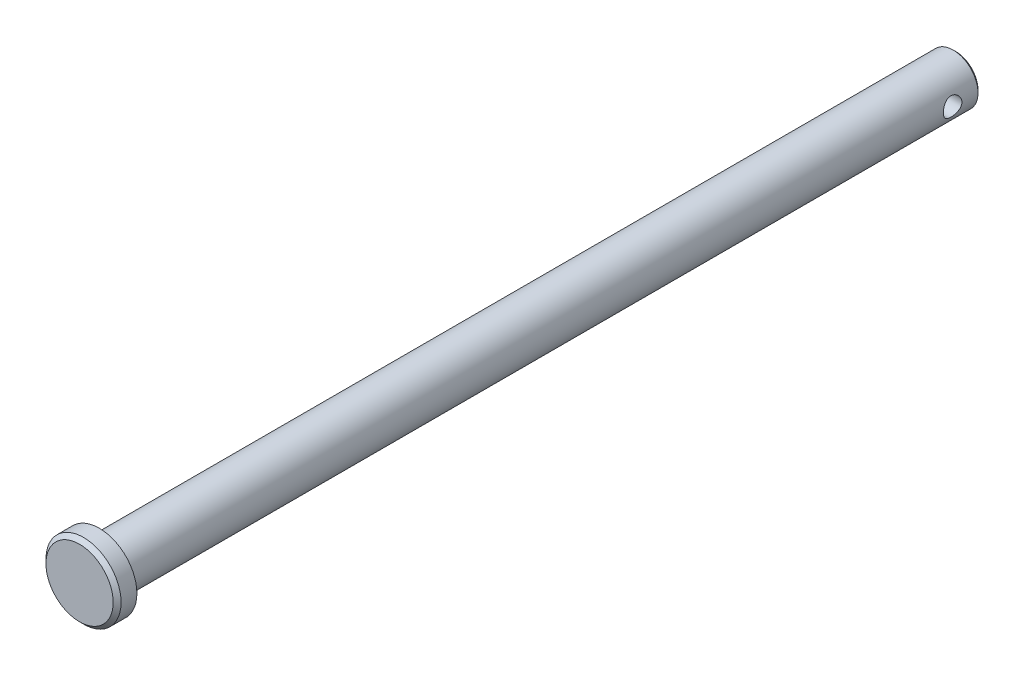
ISO-10303-21;
HEADER;
FILE_DESCRIPTION(('STEP AP214'),'2;1');
FILE_NAME('part.step','',(''),(''),'','','');
FILE_SCHEMA(('AUTOMOTIVE_DESIGN { 1 0 10303 214 1 1 1 1 }'));
ENDSEC;
DATA;
#1=APPLICATION_CONTEXT('core data for automotive mechanical design processes');
#2=APPLICATION_PROTOCOL_DEFINITION('international standard','automotive_design',2000,#1);
#3=PRODUCT_CONTEXT('',#1,'mechanical');
#4=PRODUCT('Part','Part','',(#3));
#5=PRODUCT_RELATED_PRODUCT_CATEGORY('part','',(#4));
#6=PRODUCT_DEFINITION_FORMATION('','',#4);
#7=PRODUCT_DEFINITION_CONTEXT('part definition',#1,'design');
#8=PRODUCT_DEFINITION('design','',#6,#7);
#9=PRODUCT_DEFINITION_SHAPE('','',#8);
#10=(LENGTH_UNIT() NAMED_UNIT(*) SI_UNIT(.MILLI.,.METRE.));
#11=(NAMED_UNIT(*) PLANE_ANGLE_UNIT() SI_UNIT($,.RADIAN.));
#12=(NAMED_UNIT(*) SI_UNIT($,.STERADIAN.) SOLID_ANGLE_UNIT());
#13=UNCERTAINTY_MEASURE_WITH_UNIT(LENGTH_MEASURE(1.E-05),#10,'distance_accuracy_value','');
#14=(GEOMETRIC_REPRESENTATION_CONTEXT(3) GLOBAL_UNCERTAINTY_ASSIGNED_CONTEXT((#13)) GLOBAL_UNIT_ASSIGNED_CONTEXT((#10,
#11,#12)) REPRESENTATION_CONTEXT('',''));
#15=CARTESIAN_POINT('',(0.,0.,0.));
#16=DIRECTION('',(0.,0.,1.));
#17=DIRECTION('',(1.,0.,0.));
#18=AXIS2_PLACEMENT_3D('',#15,#16,#17);
#19=CARTESIAN_POINT('',(0.,0.,55.));
#20=DIRECTION('',(0.,0.,-1.));
#21=DIRECTION('',(-1.,0.,0.));
#22=AXIS2_PLACEMENT_3D('',#19,#20,#21);
#23=CYLINDRICAL_SURFACE('',#22,3.175);
#24=CARTESIAN_POINT('',(0.,0.,-54.6825));
#25=DIRECTION('',(0.,0.,1.));
#26=DIRECTION('',(1.,0.,0.));
#27=AXIS2_PLACEMENT_3D('',#24,#25,#26);
#28=CIRCLE('',#27,3.175);
#29=CARTESIAN_POINT('',(3.175,0.,-54.6825));
#30=VERTEX_POINT('',#29);
#31=EDGE_CURVE('E38',#30,#30,#28,.T.);
#32=ORIENTED_EDGE('',*,*,#31,.T.);
#33=EDGE_LOOP('',(#32));
#34=FACE_BOUND('',#33,.T.);
#35=CARTESIAN_POINT('',(-3.175,0.,-50.234325));
#36=CARTESIAN_POINT('',(-3.1750017260582,-0.064480328031921,-50.2343226962969));
#37=CARTESIAN_POINT('',(-3.17301863556027,-0.128944879414298,-50.2395794346971));
#38=CARTESIAN_POINT('',(-3.16530589955499,-0.255947427804688,-50.2603823799955));
#39=CARTESIAN_POINT('',(-3.15957679372107,-0.318485700965171,-50.2759271047485));
#40=CARTESIAN_POINT('',(-3.14498698210789,-0.439785748086511,-50.3166789451563));
#41=CARTESIAN_POINT('',(-3.13613231952368,-0.498554552928809,-50.3418674227273));
#42=CARTESIAN_POINT('',(-3.11617334413749,-0.611028202439702,-50.4010969653313));
#43=CARTESIAN_POINT('',(-3.10506842811866,-0.664731683597442,-50.4351404047757));
#44=CARTESIAN_POINT('',(-3.08122833533403,-0.767831218530127,-50.5126236965375));
#45=CARTESIAN_POINT('',(-3.06844702050705,-0.816983642057514,-50.5563733956684));
#46=CARTESIAN_POINT('',(-3.04292175316615,-0.907450095452763,-50.6513695325105));
#47=CARTESIAN_POINT('',(-3.03017781325932,-0.948761726101175,-50.7026182563948));
#48=CARTESIAN_POINT('',(-3.00563336052824,-1.02392323008938,-50.8135382398466));
#49=CARTESIAN_POINT('',(-2.99388727501525,-1.05742893349135,-50.8734559659457));
#50=CARTESIAN_POINT('',(-2.97338639063463,-1.1137792552768,-50.9985858811213));
#51=CARTESIAN_POINT('',(-2.96463039737105,-1.13662813187984,-51.0637959432544));
#52=CARTESIAN_POINT('',(-2.95159440179158,-1.1700544212018,-51.1948551625799));
#53=CARTESIAN_POINT('',(-2.94714552453477,-1.18109677117231,-51.2605683742581));
#54=CARTESIAN_POINT('',(-2.94273336284839,-1.19205022996996,-51.3930540754076));
#55=CARTESIAN_POINT('',(-2.94276822592073,-1.19196593587088,-51.4598261160129));
#56=CARTESIAN_POINT('',(-2.94717399857943,-1.18102403502952,-51.5882795606378));
#57=CARTESIAN_POINT('',(-2.95128528416453,-1.17081148004022,-51.6500264691726));
#58=CARTESIAN_POINT('',(-2.96294919584751,-1.14096933245487,-51.7708560506342));
#59=CARTESIAN_POINT('',(-2.97050234018473,-1.12133832170211,-51.8299383208748));
#60=CARTESIAN_POINT('',(-2.98835526113513,-1.07286225428949,-51.9450761725093));
#61=CARTESIAN_POINT('',(-2.99870429903107,-1.04384989935074,-52.0010533421088));
#62=CARTESIAN_POINT('',(-3.02096654298085,-0.977551335491413,-52.1075319292128));
#63=CARTESIAN_POINT('',(-3.03288028850369,-0.940262269910617,-52.1580314471563));
#64=CARTESIAN_POINT('',(-3.05790630844421,-0.855517884834482,-52.2556916580229));
#65=CARTESIAN_POINT('',(-3.07104532042939,-0.807547746065835,-52.3023998585938));
#66=CARTESIAN_POINT('',(-3.09635309230243,-0.704304368962597,-52.3872432606759));
#67=CARTESIAN_POINT('',(-3.10852170288599,-0.649030010276031,-52.4253771445933));
#68=CARTESIAN_POINT('',(-3.13075950879707,-0.531592978112732,-52.4924885026684));
#69=CARTESIAN_POINT('',(-3.1407933299357,-0.469337004114245,-52.5213152675942));
#70=CARTESIAN_POINT('',(-3.15736857672026,-0.340389250103888,-52.5679361921393));
#71=CARTESIAN_POINT('',(-3.1639115533356,-0.273699454858827,-52.5857352518954));
#72=CARTESIAN_POINT('',(-3.17249526812277,-0.141585349249252,-52.6089255876114));
#73=CARTESIAN_POINT('',(-3.17475686664138,-0.0762822480275031,-52.6149261938161));
#74=CARTESIAN_POINT('',(-3.17520553124475,0.054429402233676,-52.6161235319706));
#75=CARTESIAN_POINT('',(-3.17339350069573,0.119837924680553,-52.6113226592514));
#76=CARTESIAN_POINT('',(-3.16604419632035,0.246270501045977,-52.5915164039175));
#77=CARTESIAN_POINT('',(-3.16065273826329,0.307366454105824,-52.5769102121587));
#78=CARTESIAN_POINT('',(-3.1468335994155,0.426197517997295,-52.5384335549156));
#79=CARTESIAN_POINT('',(-3.13840552373861,0.483932190588357,-52.5145618845037));
#80=CARTESIAN_POINT('',(-3.11903764373597,0.596302913556188,-52.4574707851262));
#81=CARTESIAN_POINT('',(-3.1080313141617,0.650798072574003,-52.4239973024289));
#82=CARTESIAN_POINT('',(-3.08472420554452,0.753580464933011,-52.3489400056076));
#83=CARTESIAN_POINT('',(-3.07242294938803,0.801865395464672,-52.3073531972923));
#84=CARTESIAN_POINT('',(-3.04699455283473,0.893786946503482,-52.2144104780639));
#85=CARTESIAN_POINT('',(-3.03386090349835,0.936991348355828,-52.1626277674242));
#86=CARTESIAN_POINT('',(-3.00893809999065,1.01418270962824,-52.0522892133883));
#87=CARTESIAN_POINT('',(-2.99714906660554,1.04816884135274,-51.9937327624604));
#88=CARTESIAN_POINT('',(-2.9762992117158,1.10599357730704,-51.8710248104995));
#89=CARTESIAN_POINT('',(-2.96724991010742,1.12978950323491,-51.8068511079336));
#90=CARTESIAN_POINT('',(-2.95317888607235,1.16608132501843,-51.6749735000728));
#91=CARTESIAN_POINT('',(-2.94815467214383,1.17858421180019,-51.6072718062677));
#92=CARTESIAN_POINT('',(-2.94303366491605,1.1913103800891,-51.4749434233642));
#93=CARTESIAN_POINT('',(-2.94264115340402,1.19227069374821,-51.4103984735747));
#94=CARTESIAN_POINT('',(-2.94606990116575,1.18377268040514,-51.2821184052058));
#95=CARTESIAN_POINT('',(-2.94989076088501,1.17431534131036,-51.2183832104169));
#96=CARTESIAN_POINT('',(-2.96106962383437,1.14582428656504,-51.0955062637937));
#97=CARTESIAN_POINT('',(-2.96831611517726,1.12709164913741,-51.0362836876677));
#98=CARTESIAN_POINT('',(-2.98546478961414,1.08084696819061,-50.9217875026325));
#99=CARTESIAN_POINT('',(-2.99536764396202,1.0533327052505,-50.8665148963443));
#100=CARTESIAN_POINT('',(-3.01735905848772,0.988632102759095,-50.7583374856775));
#101=CARTESIAN_POINT('',(-3.02953498137515,0.951014360373894,-50.7057086800401));
#102=CARTESIAN_POINT('',(-3.05439958363509,0.867842480481129,-50.6072751359791));
#103=CARTESIAN_POINT('',(-3.06708842498621,0.822285820601664,-50.561472575013));
#104=CARTESIAN_POINT('',(-3.09237399534093,0.721582564947793,-50.4754646975664));
#105=CARTESIAN_POINT('',(-3.10492858264887,0.666050423844062,-50.4356963957112));
#106=CARTESIAN_POINT('',(-3.12780770850268,0.548650495915651,-50.3660695173742));
#107=CARTESIAN_POINT('',(-3.13813207344675,0.486782216434429,-50.3362117122343));
#108=CARTESIAN_POINT('',(-3.15574594756552,0.355599271339333,-50.2864133919429));
#109=CARTESIAN_POINT('',(-3.16288465369445,0.286078153898402,-50.2669583924722));
#110=CARTESIAN_POINT('',(-3.17250954730047,0.144363863550065,-50.240918713063));
#111=CARTESIAN_POINT('',(-3.17499806804399,0.0721720492396064,-50.2343275785069));
#112=CARTESIAN_POINT('',(-3.175,0.,-50.234325));
#113=B_SPLINE_CURVE_WITH_KNOTS('',3,(#35,#36,#37,#38,#39,#40,#41,#42,#43,#44,#45,#46,#47,#48,
#49,#50,#51,#52,#53,#54,#55,#56,#57,#58,#59,#60,#61,#62,#63,#64,#65,#66,#67,#68,#69,#70,#71,#72,
#73,#74,#75,#76,#77,#78,#79,#80,#81,#82,#83,#84,#85,#86,#87,#88,#89,#90,#91,#92,#93,#94,#95,#96,
#97,#98,#99,#100,#101,#102,#103,#104,#105,#106,#107,#108,#109,#110,#111,#112),.UNSPECIFIED.,.T.,
.F.,(4,2,2,2,2,2,2,2,2,2,2,2,2,2,2,2,2,2,2,2,2,2,2,2,2,2,2,2,2,2,2,2,2,2,2,2,2,2,4),(0.,
0.193174779988696,0.386321736189804,0.579097274313275,0.771924557565038,0.972134347500311,
1.17240530159713,1.38030485385692,1.58812126298256,1.78741287818417,1.98662215450768,
2.17390936438978,2.36122478335594,2.55208411657196,2.74300942653256,2.94676634210303,
3.15055454712147,3.35749404133323,3.5643415163596,3.76019234336017,3.95599974284977,
4.14428335102049,4.33259145270723,4.52643257351058,4.72034536640771,4.92550862317929,
5.13069029517863,5.33672309214718,5.54262825746729,5.73531018512452,5.92797384230189,
6.11475744301062,6.30158828783604,6.49821274558142,6.6948997896017,6.90223036662895,
7.10957707657801,7.32590383806685,7.54212202675678),.UNSPECIFIED.);
#114=CARTESIAN_POINT('',(-3.175,0.,-50.234325));
#115=VERTEX_POINT('',#114);
#116=EDGE_CURVE('E49',#115,#115,#113,.T.);
#117=ORIENTED_EDGE('',*,*,#116,.T.);
#118=EDGE_LOOP('',(#117));
#119=FACE_BOUND('',#118,.T.);
#120=CARTESIAN_POINT('',(3.175,0.,-52.615575));
#121=CARTESIAN_POINT('',(3.1750017260582,-0.0644803280319211,-52.6155773037031));
#122=CARTESIAN_POINT('',(3.17301863556027,-0.128944879414298,-52.6103205653028));
#123=CARTESIAN_POINT('',(3.16530589955499,-0.255947427804688,-52.5895176200045));
#124=CARTESIAN_POINT('',(3.15957679372107,-0.318485700965171,-52.5739728952515));
#125=CARTESIAN_POINT('',(3.14498698210789,-0.439785748086511,-52.5332210548437));
#126=CARTESIAN_POINT('',(3.13613231952368,-0.498554552928809,-52.5080325772727));
#127=CARTESIAN_POINT('',(3.11617334413749,-0.611028202439702,-52.4488030346687));
#128=CARTESIAN_POINT('',(3.10506842811866,-0.664731683597442,-52.4147595952243));
#129=CARTESIAN_POINT('',(3.08122833533403,-0.767831218530127,-52.3372763034625));
#130=CARTESIAN_POINT('',(3.06844702050705,-0.816983642057514,-52.2935266043316));
#131=CARTESIAN_POINT('',(3.04292175316615,-0.907450095452763,-52.1985304674895));
#132=CARTESIAN_POINT('',(3.03017781325932,-0.948761726101175,-52.1472817436052));
#133=CARTESIAN_POINT('',(3.00563336052824,-1.02392323008938,-52.0363617601534));
#134=CARTESIAN_POINT('',(2.99388727501525,-1.05742893349135,-51.9764440340542));
#135=CARTESIAN_POINT('',(2.97338639063463,-1.1137792552768,-51.8513141188787));
#136=CARTESIAN_POINT('',(2.96463039737105,-1.13662813187984,-51.7861040567456));
#137=CARTESIAN_POINT('',(2.95159440179158,-1.1700544212018,-51.6550448374201));
#138=CARTESIAN_POINT('',(2.94714552453477,-1.18109677117231,-51.5893316257419));
#139=CARTESIAN_POINT('',(2.94273336284839,-1.19205022996996,-51.4568459245924));
#140=CARTESIAN_POINT('',(2.94276822592073,-1.19196593587088,-51.3900738839871));
#141=CARTESIAN_POINT('',(2.94717399857943,-1.18102403502952,-51.2616204393622));
#142=CARTESIAN_POINT('',(2.95128528416453,-1.17081148004022,-51.1998735308274));
#143=CARTESIAN_POINT('',(2.96294919584751,-1.14096933245487,-51.0790439493658));
#144=CARTESIAN_POINT('',(2.97050234018473,-1.12133832170211,-51.0199616791252));
#145=CARTESIAN_POINT('',(2.98835526113513,-1.07286225428949,-50.9048238274907));
#146=CARTESIAN_POINT('',(2.99870429903107,-1.04384989935074,-50.8488466578912));
#147=CARTESIAN_POINT('',(3.02096654298085,-0.977551335491415,-50.7423680707872));
#148=CARTESIAN_POINT('',(3.03288028850369,-0.940262269910621,-50.6918685528437));
#149=CARTESIAN_POINT('',(3.05790630844421,-0.855517884834488,-50.5942083419771));
#150=CARTESIAN_POINT('',(3.07104532042938,-0.80754774606584,-50.5475001414062));
#151=CARTESIAN_POINT('',(3.09635309230243,-0.704304368962601,-50.4626567393241));
#152=CARTESIAN_POINT('',(3.10852170288599,-0.649030010276034,-50.4245228554067));
#153=CARTESIAN_POINT('',(3.13075950879707,-0.531592978112732,-50.3574114973316));
#154=CARTESIAN_POINT('',(3.1407933299357,-0.469337004114245,-50.3285847324058));
#155=CARTESIAN_POINT('',(3.15736857672026,-0.340389250103886,-50.2819638078606));
#156=CARTESIAN_POINT('',(3.1639115533356,-0.273699454858827,-50.2641647481046));
#157=CARTESIAN_POINT('',(3.17249526812277,-0.141585349249252,-50.2409744123886));
#158=CARTESIAN_POINT('',(3.17475686664138,-0.0762822480275028,-50.2349738061839));
#159=CARTESIAN_POINT('',(3.17520553124475,0.0544294022336763,-50.2337764680294));
#160=CARTESIAN_POINT('',(3.17339350069573,0.119837924680553,-50.2385773407486));
#161=CARTESIAN_POINT('',(3.16604419632035,0.246270501045978,-50.2583835960825));
#162=CARTESIAN_POINT('',(3.16065273826329,0.307366454105826,-50.2729897878413));
#163=CARTESIAN_POINT('',(3.1468335994155,0.426197517997297,-50.3114664450844));
#164=CARTESIAN_POINT('',(3.13840552373861,0.483932190588357,-50.3353381154962));
#165=CARTESIAN_POINT('',(3.11903764373597,0.596302913556187,-50.3924292148738));
#166=CARTESIAN_POINT('',(3.1080313141617,0.650798072574003,-50.4259026975711));
#167=CARTESIAN_POINT('',(3.08472420554452,0.753580464933012,-50.5009599943924));
#168=CARTESIAN_POINT('',(3.07242294938803,0.801865395464673,-50.5425468027077));
#169=CARTESIAN_POINT('',(3.04699455283473,0.893786946503483,-50.6354895219361));
#170=CARTESIAN_POINT('',(3.03386090349835,0.936991348355827,-50.6872722325758));
#171=CARTESIAN_POINT('',(3.00893809999065,1.01418270962823,-50.7976107866117));
#172=CARTESIAN_POINT('',(2.99714906660554,1.04816884135274,-50.8561672375396));
#173=CARTESIAN_POINT('',(2.9762992117158,1.10599357730705,-50.9788751895005));
#174=CARTESIAN_POINT('',(2.96724991010741,1.12978950323492,-51.0430488920664));
#175=CARTESIAN_POINT('',(2.95317888607235,1.16608132501844,-51.1749264999272));
#176=CARTESIAN_POINT('',(2.94815467214383,1.17858421180019,-51.2426281937323));
#177=CARTESIAN_POINT('',(2.94303366491605,1.1913103800891,-51.3749565766358));
#178=CARTESIAN_POINT('',(2.94264115340402,1.19227069374821,-51.4395015264253));
#179=CARTESIAN_POINT('',(2.94606990116575,1.18377268040514,-51.5677815947942));
#180=CARTESIAN_POINT('',(2.94989076088501,1.17431534131036,-51.6315167895831));
#181=CARTESIAN_POINT('',(2.96106962383437,1.14582428656504,-51.7543937362063));
#182=CARTESIAN_POINT('',(2.96831611517726,1.12709164913741,-51.8136163123322));
#183=CARTESIAN_POINT('',(2.98546478961414,1.08084696819061,-51.9281124973675));
#184=CARTESIAN_POINT('',(2.99536764396202,1.0533327052505,-51.9833851036557));
#185=CARTESIAN_POINT('',(3.01735905848772,0.988632102759095,-52.0915625143225));
#186=CARTESIAN_POINT('',(3.02953498137515,0.951014360373894,-52.1441913199599));
#187=CARTESIAN_POINT('',(3.05439958363509,0.867842480481129,-52.2426248640209));
#188=CARTESIAN_POINT('',(3.06708842498621,0.822285820601664,-52.288427424987));
#189=CARTESIAN_POINT('',(3.09237399534093,0.721582564947793,-52.3744353024336));
#190=CARTESIAN_POINT('',(3.10492858264887,0.666050423844062,-52.4142036042888));
#191=CARTESIAN_POINT('',(3.12780770850268,0.548650495915651,-52.4838304826258));
#192=CARTESIAN_POINT('',(3.13813207344675,0.486782216434429,-52.5136882877657));
#193=CARTESIAN_POINT('',(3.15574594756552,0.355599271339333,-52.5634866080571));
#194=CARTESIAN_POINT('',(3.16288465369445,0.286078153898402,-52.5829416075278));
#195=CARTESIAN_POINT('',(3.17250954730047,0.144363863550066,-52.608981286937));
#196=CARTESIAN_POINT('',(3.17499806804399,0.0721720492396069,-52.6155724214931));
#197=CARTESIAN_POINT('',(3.175,0.,-52.615575));
#198=B_SPLINE_CURVE_WITH_KNOTS('',3,(#120,#121,#122,#123,#124,#125,#126,#127,#128,#129,#130,
#131,#132,#133,#134,#135,#136,#137,#138,#139,#140,#141,#142,#143,#144,#145,#146,#147,#148,#149,
#150,#151,#152,#153,#154,#155,#156,#157,#158,#159,#160,#161,#162,#163,#164,#165,#166,#167,#168,
#169,#170,#171,#172,#173,#174,#175,#176,#177,#178,#179,#180,#181,#182,#183,#184,#185,#186,#187,
#188,#189,#190,#191,#192,#193,#194,#195,#196,#197),.UNSPECIFIED.,.T.,.F.,(4,2,2,2,2,2,2,2,2,2,2,
2,2,2,2,2,2,2,2,2,2,2,2,2,2,2,2,2,2,2,2,2,2,2,2,2,2,2,4),(0.,0.193174779988695,
0.386321736189804,0.579097274313274,0.771924557565037,0.972134347500311,1.17240530159713,
1.38030485385692,1.58812126298256,1.78741287818416,1.98662215450768,2.17390936438978,
2.36122478335594,2.55208411657196,2.74300942653255,2.94676634210302,3.15055454712147,
3.35749404133323,3.5643415163596,3.76019234336017,3.95599974284977,4.14428335102049,
4.33259145270723,4.52643257351058,4.72034536640771,4.92550862317929,5.13069029517863,
5.33672309214719,5.54262825746729,5.73531018512451,5.92797384230188,6.11475744301063,
6.30158828783604,6.49821274558142,6.69489978960169,6.90223036662895,7.10957707657801,
7.32590383806685,7.54212202675677),.UNSPECIFIED.);
#199=CARTESIAN_POINT('',(3.175,0.,-52.615575));
#200=VERTEX_POINT('',#199);
#201=EDGE_CURVE('E57',#200,#200,#198,.T.);
#202=ORIENTED_EDGE('',*,*,#201,.T.);
#203=EDGE_LOOP('',(#202));
#204=FACE_BOUND('',#203,.T.);
#205=CARTESIAN_POINT('',(0.,0.,55.));
#206=DIRECTION('',(0.,0.,1.));
#207=DIRECTION('',(1.,0.,0.));
#208=AXIS2_PLACEMENT_3D('',#205,#206,#207);
#209=CIRCLE('',#208,3.175);
#210=CARTESIAN_POINT('',(3.175,0.,55.));
#211=VERTEX_POINT('',#210);
#212=EDGE_CURVE('E95',#211,#211,#209,.T.);
#213=ORIENTED_EDGE('',*,*,#212,.F.);
#214=EDGE_LOOP('',(#213));
#215=FACE_BOUND('',#214,.T.);
#216=ADVANCED_FACE('F31',(#34,#119,#204,#215),#23,.T.);
#217=CARTESIAN_POINT('',(0.,0.,-55.));
#218=DIRECTION('',(0.,0.,1.));
#219=DIRECTION('',(1.,0.,0.));
#220=AXIS2_PLACEMENT_3D('',#217,#218,#219);
#221=PLANE('',#220);
#222=CARTESIAN_POINT('',(0.,0.,-55.));
#223=DIRECTION('',(0.,0.,1.));
#224=DIRECTION('',(1.,0.,0.));
#225=AXIS2_PLACEMENT_3D('',#222,#223,#224);
#226=CIRCLE('',#225,2.85749999999998);
#227=CARTESIAN_POINT('',(2.85749999999998,0.,-55.));
#228=VERTEX_POINT('',#227);
#229=EDGE_CURVE('E10',#228,#228,#226,.F.);
#230=ORIENTED_EDGE('',*,*,#229,.T.);
#231=EDGE_LOOP('',(#230));
#232=FACE_BOUND('',#231,.T.);
#233=ADVANCED_FACE('F79',(#232),#221,.F.);
#234=CARTESIAN_POINT('',(0.,0.,57.54));
#235=DIRECTION('',(0.,0.,-1.));
#236=DIRECTION('',(-1.,0.,0.));
#237=AXIS2_PLACEMENT_3D('',#234,#235,#236);
#238=CYLINDRICAL_SURFACE('',#237,4.826);
#239=CARTESIAN_POINT('',(0.,0.,57.032));
#240=DIRECTION('',(0.,0.,1.));
#241=DIRECTION('',(1.,0.,0.));
#242=AXIS2_PLACEMENT_3D('',#239,#240,#241);
#243=CIRCLE('',#242,4.826);
#244=CARTESIAN_POINT('',(4.826,0.,57.032));
#245=VERTEX_POINT('',#244);
#246=EDGE_CURVE('E42',#245,#245,#243,.F.);
#247=ORIENTED_EDGE('',*,*,#246,.T.);
#248=EDGE_LOOP('',(#247));
#249=FACE_BOUND('',#248,.T.);
#250=CARTESIAN_POINT('',(0.,0.,55.));
#251=DIRECTION('',(0.,0.,1.));
#252=DIRECTION('',(1.,0.,0.));
#253=AXIS2_PLACEMENT_3D('',#250,#251,#252);
#254=CIRCLE('',#253,4.826);
#255=CARTESIAN_POINT('',(4.826,0.,55.));
#256=VERTEX_POINT('',#255);
#257=EDGE_CURVE('E56',#256,#256,#254,.T.);
#258=ORIENTED_EDGE('',*,*,#257,.T.);
#259=EDGE_LOOP('',(#258));
#260=FACE_BOUND('',#259,.T.);
#261=ADVANCED_FACE('F73',(#249,#260),#238,.T.);
#262=CARTESIAN_POINT('',(0.,0.,57.54));
#263=DIRECTION('',(0.,0.,1.));
#264=DIRECTION('',(1.,0.,0.));
#265=AXIS2_PLACEMENT_3D('',#262,#263,#264);
#266=PLANE('',#265);
#267=CARTESIAN_POINT('',(0.,0.,57.54));
#268=DIRECTION('',(0.,0.,1.));
#269=DIRECTION('',(1.,0.,0.));
#270=AXIS2_PLACEMENT_3D('',#267,#268,#269);
#271=CIRCLE('',#270,4.318);
#272=CARTESIAN_POINT('',(4.318,0.,57.54));
#273=VERTEX_POINT('',#272);
#274=EDGE_CURVE('E46',#273,#273,#271,.T.);
#275=ORIENTED_EDGE('',*,*,#274,.T.);
#276=EDGE_LOOP('',(#275));
#277=FACE_BOUND('',#276,.T.);
#278=ADVANCED_FACE('F68',(#277),#266,.T.);
#279=CARTESIAN_POINT('',(0.,0.,55.));
#280=DIRECTION('',(0.,0.,1.));
#281=DIRECTION('',(1.,0.,0.));
#282=AXIS2_PLACEMENT_3D('',#279,#280,#281);
#283=PLANE('',#282);
#284=ORIENTED_EDGE('',*,*,#212,.T.);
#285=EDGE_LOOP('',(#284));
#286=FACE_BOUND('',#285,.T.);
#287=ORIENTED_EDGE('',*,*,#257,.F.);
#288=EDGE_LOOP('',(#287));
#289=FACE_BOUND('',#288,.T.);
#290=ADVANCED_FACE('F72',(#286,#289),#283,.F.);
#291=CARTESIAN_POINT('',(0.,0.,57.54));
#292=DIRECTION('',(0.,0.,-1.));
#293=DIRECTION('',(-1.,0.,0.));
#294=AXIS2_PLACEMENT_3D('',#291,#292,#293);
#295=CONICAL_SURFACE('',#294,4.318,0.785398163397444);
#296=ORIENTED_EDGE('',*,*,#246,.F.);
#297=EDGE_LOOP('',(#296));
#298=FACE_BOUND('',#297,.T.);
#299=ORIENTED_EDGE('',*,*,#274,.F.);
#300=EDGE_LOOP('',(#299));
#301=FACE_BOUND('',#300,.T.);
#302=ADVANCED_FACE('F66',(#298,#301),#295,.T.);
#303=CARTESIAN_POINT('',(-4.826,0.,-51.42495));
#304=DIRECTION('',(1.,0.,0.));
#305=DIRECTION('',(0.,0.,-1.));
#306=AXIS2_PLACEMENT_3D('',#303,#304,#305);
#307=CYLINDRICAL_SURFACE('',#306,1.190625);
#308=ORIENTED_EDGE('',*,*,#201,.F.);
#309=EDGE_LOOP('',(#308));
#310=FACE_BOUND('',#309,.T.);
#311=ORIENTED_EDGE('',*,*,#116,.F.);
#312=EDGE_LOOP('',(#311));
#313=FACE_BOUND('',#312,.T.);
#314=ADVANCED_FACE('F62',(#310,#313),#307,.F.);
#315=CARTESIAN_POINT('',(0.,0.,-54.6825));
#316=DIRECTION('',(0.,0.,1.));
#317=DIRECTION('',(1.,0.,0.));
#318=AXIS2_PLACEMENT_3D('',#315,#316,#317);
#319=CONICAL_SURFACE('',#318,3.175,0.785398163397452);
#320=ORIENTED_EDGE('',*,*,#229,.F.);
#321=EDGE_LOOP('',(#320));
#322=FACE_BOUND('',#321,.T.);
#323=ORIENTED_EDGE('',*,*,#31,.F.);
#324=EDGE_LOOP('',(#323));
#325=FACE_BOUND('',#324,.T.);
#326=ADVANCED_FACE('F33',(#322,#325),#319,.T.);
#327=CLOSED_SHELL('',(#216,#233,#261,#278,#290,#302,#314,#326));
#328=MANIFOLD_SOLID_BREP('B2',#327);
#329=ADVANCED_BREP_SHAPE_REPRESENTATION('',(#18,#328),#14);
#330=SHAPE_DEFINITION_REPRESENTATION(#9,#329);
ENDSEC;
END-ISO-10303-21;
